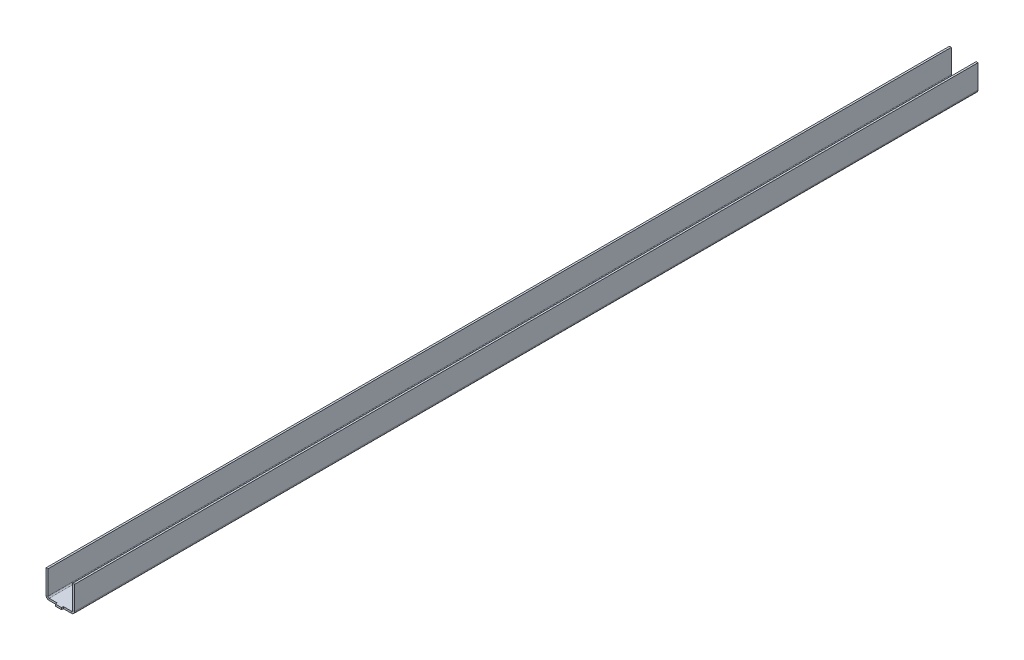
ISO-10303-21;
HEADER;
FILE_DESCRIPTION(('STEP AP214'),'2;1');
FILE_NAME('part.step','',(''),(''),'','','');
FILE_SCHEMA(('AUTOMOTIVE_DESIGN { 1 0 10303 214 1 1 1 1 }'));
ENDSEC;
DATA;
#1=APPLICATION_CONTEXT('core data for automotive mechanical design processes');
#2=APPLICATION_PROTOCOL_DEFINITION('international standard','automotive_design',2000,#1);
#3=PRODUCT_CONTEXT('',#1,'mechanical');
#4=PRODUCT('Part','Part','',(#3));
#5=PRODUCT_RELATED_PRODUCT_CATEGORY('part','',(#4));
#6=PRODUCT_DEFINITION_FORMATION('','',#4);
#7=PRODUCT_DEFINITION_CONTEXT('part definition',#1,'design');
#8=PRODUCT_DEFINITION('design','',#6,#7);
#9=PRODUCT_DEFINITION_SHAPE('','',#8);
#10=(LENGTH_UNIT() NAMED_UNIT(*) SI_UNIT(.MILLI.,.METRE.));
#11=(NAMED_UNIT(*) PLANE_ANGLE_UNIT() SI_UNIT($,.RADIAN.));
#12=(NAMED_UNIT(*) SI_UNIT($,.STERADIAN.) SOLID_ANGLE_UNIT());
#13=UNCERTAINTY_MEASURE_WITH_UNIT(LENGTH_MEASURE(1.E-05),#10,'distance_accuracy_value','');
#14=(GEOMETRIC_REPRESENTATION_CONTEXT(3) GLOBAL_UNCERTAINTY_ASSIGNED_CONTEXT((#13)) GLOBAL_UNIT_ASSIGNED_CONTEXT((#10,
#11,#12)) REPRESENTATION_CONTEXT('',''));
#15=CARTESIAN_POINT('',(0.,0.,0.));
#16=DIRECTION('',(0.,0.,1.));
#17=DIRECTION('',(1.,0.,0.));
#18=AXIS2_PLACEMENT_3D('',#15,#16,#17);
#19=CARTESIAN_POINT('',(1444.49647644812,-1.49999999999062,1829.98412298286));
#20=DIRECTION('',(0.,1.,0.));
#21=DIRECTION('',(-1.,0.,0.));
#22=AXIS2_PLACEMENT_3D('',#19,#20,#21);
#23=PLANE('',#22);
#24=DIRECTION('',(0.,0.,1.));
#25=VECTOR('',#24,1.);
#26=CARTESIAN_POINT('',(-11.5000000000001,-1.50000000000326,1829.98412298286));
#27=LINE('',#26,#25);
#28=CARTESIAN_POINT('',(-11.5000000000001,-1.50000000000325,1071.5));
#29=VERTEX_POINT('',#28);
#30=CARTESIAN_POINT('',(-11.5000000000001,-1.50000000000326,1798.5));
#31=VERTEX_POINT('',#30);
#32=EDGE_CURVE('E265',#29,#31,#27,.T.);
#33=ORIENTED_EDGE('',*,*,#32,.T.);
#34=DIRECTION('',(-1.,0.,0.));
#35=VECTOR('',#34,1.);
#36=CARTESIAN_POINT('',(1444.49647644812,-1.49999999999063,1798.5));
#37=LINE('',#36,#35);
#38=CARTESIAN_POINT('',(-10.0000000000001,-1.50000000000325,1798.5));
#39=VERTEX_POINT('',#38);
#40=EDGE_CURVE('E257',#39,#31,#37,.T.);
#41=ORIENTED_EDGE('',*,*,#40,.F.);
#42=DIRECTION('',(0.,0.,1.));
#43=VECTOR('',#42,1.);
#44=CARTESIAN_POINT('',(-10.0000000000001,-1.50000000000324,1829.98412298286));
#45=LINE('',#44,#43);
#46=CARTESIAN_POINT('',(-10.0000000000001,-1.50000000000324,1071.5));
#47=VERTEX_POINT('',#46);
#48=EDGE_CURVE('E523',#39,#47,#45,.F.);
#49=ORIENTED_EDGE('',*,*,#48,.T.);
#50=DIRECTION('',(-1.,0.,0.));
#51=VECTOR('',#50,1.);
#52=CARTESIAN_POINT('',(1444.49647644812,-1.49999999999062,1071.5));
#53=LINE('',#52,#51);
#54=EDGE_CURVE('E267',#47,#29,#53,.T.);
#55=ORIENTED_EDGE('',*,*,#54,.T.);
#56=EDGE_LOOP('',(#33,#41,#49,#55));
#57=FACE_BOUND('',#56,.T.);
#58=ADVANCED_FACE('F53',(#57),#23,.T.);
#59=CARTESIAN_POINT('',(1444.49647644812,-22.9999999999907,1071.5));
#60=DIRECTION('',(0.,0.,-1.));
#61=DIRECTION('',(0.,-1.,0.));
#62=AXIS2_PLACEMENT_3D('',#59,#60,#61);
#63=PLANE('',#62);
#64=DIRECTION('',(0.,1.,0.));
#65=VECTOR('',#64,1.);
#66=CARTESIAN_POINT('',(-11.5000000000001,-1.50000000000325,1071.5));
#67=LINE('',#66,#65);
#68=CARTESIAN_POINT('',(-11.5,-20.5000000000033,1071.5));
#69=VERTEX_POINT('',#68);
#70=EDGE_CURVE('E251',#69,#29,#67,.T.);
#71=ORIENTED_EDGE('',*,*,#70,.T.);
#72=ORIENTED_EDGE('',*,*,#54,.F.);
#73=DIRECTION('',(0.,1.,0.));
#74=VECTOR('',#73,1.);
#75=CARTESIAN_POINT('',(-10.0000000000001,-23.0000000000033,1071.5));
#76=LINE('',#75,#74);
#77=CARTESIAN_POINT('',(-9.99999999999983,-20.5000000000033,1071.5));
#78=VERTEX_POINT('',#77);
#79=EDGE_CURVE('E108',#47,#78,#76,.F.);
#80=ORIENTED_EDGE('',*,*,#79,.T.);
#81=DIRECTION('',(-1.,0.,0.));
#82=VECTOR('',#81,1.);
#83=CARTESIAN_POINT('',(1444.49647644812,-20.4999999999907,1071.5));
#84=LINE('',#83,#82);
#85=EDGE_CURVE('E248',#78,#69,#84,.T.);
#86=ORIENTED_EDGE('',*,*,#85,.T.);
#87=EDGE_LOOP('',(#71,#72,#80,#86));
#88=FACE_BOUND('',#87,.T.);
#89=ADVANCED_FACE('F250',(#88),#63,.T.);
#90=CARTESIAN_POINT('',(-11.5000000000001,-1.50000000000326,1829.98412298286));
#91=DIRECTION('',(1.,0.,0.));
#92=DIRECTION('',(0.,1.,0.));
#93=AXIS2_PLACEMENT_3D('',#90,#91,#92);
#94=PLANE('',#93);
#95=ORIENTED_EDGE('',*,*,#32,.F.);
#96=ORIENTED_EDGE('',*,*,#70,.F.);
#97=DIRECTION('',(0.,0.,-1.));
#98=VECTOR('',#97,1.);
#99=CARTESIAN_POINT('',(-11.4999999999999,-20.5000000000033,1829.98412298286));
#100=LINE('',#99,#98);
#101=CARTESIAN_POINT('',(-11.5,-20.5000000000033,1798.5));
#102=VERTEX_POINT('',#101);
#103=EDGE_CURVE('E263',#102,#69,#100,.T.);
#104=ORIENTED_EDGE('',*,*,#103,.F.);
#105=DIRECTION('',(0.,1.,0.));
#106=VECTOR('',#105,1.);
#107=CARTESIAN_POINT('',(-11.5000000000001,-1.50000000000326,1798.5));
#108=LINE('',#107,#106);
#109=EDGE_CURVE('E434',#31,#102,#108,.F.);
#110=ORIENTED_EDGE('',*,*,#109,.F.);
#111=EDGE_LOOP('',(#95,#96,#104,#110));
#112=FACE_BOUND('',#111,.T.);
#113=ADVANCED_FACE('F262',(#112),#94,.F.);
#114=CARTESIAN_POINT('',(1444.49647644812,-1.49999999999063,1798.5));
#115=DIRECTION('',(0.,0.,-1.));
#116=DIRECTION('',(0.,-1.,0.));
#117=AXIS2_PLACEMENT_3D('',#114,#115,#116);
#118=PLANE('',#117);
#119=ORIENTED_EDGE('',*,*,#40,.T.);
#120=ORIENTED_EDGE('',*,*,#109,.T.);
#121=DIRECTION('',(-1.,0.,0.));
#122=VECTOR('',#121,1.);
#123=CARTESIAN_POINT('',(1444.49647644812,-20.4999999999907,1798.5));
#124=LINE('',#123,#122);
#125=CARTESIAN_POINT('',(-10.,-20.5000000000033,1798.5));
#126=VERTEX_POINT('',#125);
#127=EDGE_CURVE('E58',#126,#102,#124,.T.);
#128=ORIENTED_EDGE('',*,*,#127,.F.);
#129=DIRECTION('',(0.,1.,0.));
#130=VECTOR('',#129,1.);
#131=CARTESIAN_POINT('',(-10.0000000000001,-1.50000000000326,1798.5));
#132=LINE('',#131,#130);
#133=EDGE_CURVE('E12',#39,#126,#132,.F.);
#134=ORIENTED_EDGE('',*,*,#133,.F.);
#135=EDGE_LOOP('',(#119,#120,#128,#134));
#136=FACE_BOUND('',#135,.T.);
#137=ADVANCED_FACE('F534',(#136),#118,.F.);
#138=CARTESIAN_POINT('',(-10.0000000000001,-1.50000000000324,1829.98412298286));
#139=DIRECTION('',(1.,0.,0.));
#140=DIRECTION('',(0.,1.,0.));
#141=AXIS2_PLACEMENT_3D('',#138,#139,#140);
#142=PLANE('',#141);
#143=DIRECTION('',(0.,0.,-1.));
#144=VECTOR('',#143,1.);
#145=CARTESIAN_POINT('',(-9.99999999999992,-20.5000000000033,1829.98412298286));
#146=LINE('',#145,#144);
#147=EDGE_CURVE('E65',#126,#78,#146,.T.);
#148=ORIENTED_EDGE('',*,*,#147,.T.);
#149=ORIENTED_EDGE('',*,*,#79,.F.);
#150=ORIENTED_EDGE('',*,*,#48,.F.);
#151=ORIENTED_EDGE('',*,*,#133,.T.);
#152=EDGE_LOOP('',(#148,#149,#150,#151));
#153=FACE_BOUND('',#152,.T.);
#154=ADVANCED_FACE('F56',(#153),#142,.T.);
#155=CARTESIAN_POINT('',(-10.,-23.0000000000033,1829.98412298286));
#156=DIRECTION('',(0.,1.,0.));
#157=DIRECTION('',(0.,0.,1.));
#158=AXIS2_PLACEMENT_3D('',#155,#156,#157);
#159=PLANE('',#158);
#160=DIRECTION('',(0.,0.,1.));
#161=VECTOR('',#160,1.);
#162=CARTESIAN_POINT('',(-9.00000000000001,-23.0000000000033,1829.98412298286));
#163=LINE('',#162,#161);
#164=CARTESIAN_POINT('',(-9.00000000000002,-23.0000000000033,1071.5));
#165=VERTEX_POINT('',#164);
#166=CARTESIAN_POINT('',(-9.00000000000001,-23.0000000000033,1798.5));
#167=VERTEX_POINT('',#166);
#168=EDGE_CURVE('E301',#165,#167,#163,.T.);
#169=ORIENTED_EDGE('',*,*,#168,.F.);
#170=DIRECTION('',(1.,0.,0.));
#171=VECTOR('',#170,1.);
#172=CARTESIAN_POINT('',(-10.,-23.0000000000033,1071.5));
#173=LINE('',#172,#171);
#174=CARTESIAN_POINT('',(-2.50000000000001,-23.0000000000033,1071.5));
#175=VERTEX_POINT('',#174);
#176=EDGE_CURVE('E306',#175,#165,#173,.F.);
#177=ORIENTED_EDGE('',*,*,#176,.F.);
#178=DIRECTION('',(0.,0.,-1.));
#179=VECTOR('',#178,1.);
#180=CARTESIAN_POINT('',(-2.50000000000001,-23.0000000000033,1071.5));
#181=LINE('',#180,#179);
#182=CARTESIAN_POINT('',(-2.50000000000001,-23.0000000000033,1066.5));
#183=VERTEX_POINT('',#182);
#184=EDGE_CURVE('E313',#175,#183,#181,.T.);
#185=ORIENTED_EDGE('',*,*,#184,.T.);
#186=DIRECTION('',(1.,0.,0.));
#187=VECTOR('',#186,1.);
#188=CARTESIAN_POINT('',(-2.50000000000001,-23.0000000000033,1066.5));
#189=LINE('',#188,#187);
#190=CARTESIAN_POINT('',(2.5,-23.0000000000033,1066.5));
#191=VERTEX_POINT('',#190);
#192=EDGE_CURVE('E318',#183,#191,#189,.T.);
#193=ORIENTED_EDGE('',*,*,#192,.T.);
#194=DIRECTION('',(0.,0.,1.));
#195=VECTOR('',#194,1.);
#196=CARTESIAN_POINT('',(2.5,-23.0000000000033,1071.5));
#197=LINE('',#196,#195);
#198=CARTESIAN_POINT('',(2.5,-23.0000000000033,1071.5));
#199=VERTEX_POINT('',#198);
#200=EDGE_CURVE('E330',#191,#199,#197,.T.);
#201=ORIENTED_EDGE('',*,*,#200,.T.);
#202=CARTESIAN_POINT('',(8.99999999999999,-23.0000000000033,1071.5));
#203=VERTEX_POINT('',#202);
#204=EDGE_CURVE('E314',#203,#199,#173,.F.);
#205=ORIENTED_EDGE('',*,*,#204,.F.);
#206=DIRECTION('',(0.,0.,-1.));
#207=VECTOR('',#206,1.);
#208=CARTESIAN_POINT('',(8.99999999999999,-23.0000000000033,1829.98412298286));
#209=LINE('',#208,#207);
#210=CARTESIAN_POINT('',(8.99999999999999,-23.0000000000033,1798.5));
#211=VERTEX_POINT('',#210);
#212=EDGE_CURVE('E333',#211,#203,#209,.T.);
#213=ORIENTED_EDGE('',*,*,#212,.F.);
#214=DIRECTION('',(1.,0.,0.));
#215=VECTOR('',#214,1.);
#216=CARTESIAN_POINT('',(-10.,-23.0000000000033,1798.5));
#217=LINE('',#216,#215);
#218=CARTESIAN_POINT('',(2.49999999999999,-23.0000000000033,1798.5));
#219=VERTEX_POINT('',#218);
#220=EDGE_CURVE('E337',#219,#211,#217,.T.);
#221=ORIENTED_EDGE('',*,*,#220,.F.);
#222=DIRECTION('',(0.,0.,1.));
#223=VECTOR('',#222,1.);
#224=CARTESIAN_POINT('',(2.49999999999999,-23.0000000000033,1798.5));
#225=LINE('',#224,#223);
#226=CARTESIAN_POINT('',(2.49999999999999,-23.0000000000033,1800.));
#227=VERTEX_POINT('',#226);
#228=EDGE_CURVE('E342',#219,#227,#225,.T.);
#229=ORIENTED_EDGE('',*,*,#228,.T.);
#230=DIRECTION('',(-1.,0.,0.));
#231=VECTOR('',#230,1.);
#232=CARTESIAN_POINT('',(2.49999999999999,-23.0000000000033,1800.));
#233=LINE('',#232,#231);
#234=CARTESIAN_POINT('',(-2.50000000000001,-23.0000000000033,1800.));
#235=VERTEX_POINT('',#234);
#236=EDGE_CURVE('E481',#227,#235,#233,.T.);
#237=ORIENTED_EDGE('',*,*,#236,.T.);
#238=DIRECTION('',(0.,0.,-1.));
#239=VECTOR('',#238,1.);
#240=CARTESIAN_POINT('',(-2.50000000000001,-23.0000000000033,1798.5));
#241=LINE('',#240,#239);
#242=CARTESIAN_POINT('',(-2.50000000000001,-23.0000000000033,1798.5));
#243=VERTEX_POINT('',#242);
#244=EDGE_CURVE('E478',#235,#243,#241,.T.);
#245=ORIENTED_EDGE('',*,*,#244,.T.);
#246=EDGE_CURVE('E343',#167,#243,#217,.T.);
#247=ORIENTED_EDGE('',*,*,#246,.F.);
#248=EDGE_LOOP('',(#169,#177,#185,#193,#201,#205,#213,#221,#229,#237,#245,#247));
#249=FACE_BOUND('',#248,.T.);
#250=ADVANCED_FACE('F489',(#249),#159,.F.);
#251=CARTESIAN_POINT('',(11.5,1445.94165131019,1071.5));
#252=DIRECTION('',(0.,0.,-1.));
#253=DIRECTION('',(0.,1.,0.));
#254=AXIS2_PLACEMENT_3D('',#251,#252,#253);
#255=PLANE('',#254);
#256=ORIENTED_EDGE('',*,*,#204,.T.);
#257=DIRECTION('',(0.,-1.,0.));
#258=VECTOR('',#257,1.);
#259=CARTESIAN_POINT('',(2.49999999999999,1445.94165131019,1071.5));
#260=LINE('',#259,#258);
#261=CARTESIAN_POINT('',(2.49999999999999,-21.500000000003,1071.5));
#262=VERTEX_POINT('',#261);
#263=EDGE_CURVE('E425',#262,#199,#260,.T.);
#264=ORIENTED_EDGE('',*,*,#263,.F.);
#265=DIRECTION('',(-1.,0.,0.));
#266=VECTOR('',#265,1.);
#267=CARTESIAN_POINT('',(11.5,-21.5000000000033,1071.5));
#268=LINE('',#267,#266);
#269=CARTESIAN_POINT('',(8.99999999999999,-21.5000000000029,1071.5));
#270=VERTEX_POINT('',#269);
#271=EDGE_CURVE('E119',#262,#270,#268,.F.);
#272=ORIENTED_EDGE('',*,*,#271,.T.);
#273=DIRECTION('',(0.,-1.,0.));
#274=VECTOR('',#273,1.);
#275=CARTESIAN_POINT('',(8.99999999999999,1445.94165131019,1071.5));
#276=LINE('',#275,#274);
#277=EDGE_CURVE('E428',#270,#203,#276,.T.);
#278=ORIENTED_EDGE('',*,*,#277,.T.);
#279=EDGE_LOOP('',(#256,#264,#272,#278));
#280=FACE_BOUND('',#279,.T.);
#281=ADVANCED_FACE('F666',(#280),#255,.T.);
#282=CARTESIAN_POINT('',(2.49999999999999,1445.94165131019,1071.5));
#283=DIRECTION('',(1.,0.,0.));
#284=DIRECTION('',(0.,1.,0.));
#285=AXIS2_PLACEMENT_3D('',#282,#283,#284);
#286=PLANE('',#285);
#287=ORIENTED_EDGE('',*,*,#200,.F.);
#288=DIRECTION('',(0.,-1.,0.));
#289=VECTOR('',#288,1.);
#290=CARTESIAN_POINT('',(2.49999999999999,1445.94165131019,1066.5));
#291=LINE('',#290,#289);
#292=CARTESIAN_POINT('',(2.49999999999999,-21.500000000003,1066.5));
#293=VERTEX_POINT('',#292);
#294=EDGE_CURVE('E421',#293,#191,#291,.T.);
#295=ORIENTED_EDGE('',*,*,#294,.F.);
#296=DIRECTION('',(0.,0.,1.));
#297=VECTOR('',#296,1.);
#298=CARTESIAN_POINT('',(2.49999999999999,-21.5000000000033,1071.5));
#299=LINE('',#298,#297);
#300=EDGE_CURVE('E131',#293,#262,#299,.T.);
#301=ORIENTED_EDGE('',*,*,#300,.T.);
#302=ORIENTED_EDGE('',*,*,#263,.T.);
#303=EDGE_LOOP('',(#287,#295,#301,#302));
#304=FACE_BOUND('',#303,.T.);
#305=ADVANCED_FACE('F653',(#304),#286,.T.);
#306=CARTESIAN_POINT('',(-2.5,1445.94165131019,1066.5));
#307=DIRECTION('',(0.,0.,-1.));
#308=DIRECTION('',(0.,1.,0.));
#309=AXIS2_PLACEMENT_3D('',#306,#307,#308);
#310=PLANE('',#309);
#311=ORIENTED_EDGE('',*,*,#192,.F.);
#312=DIRECTION('',(0.,-1.,0.));
#313=VECTOR('',#312,1.);
#314=CARTESIAN_POINT('',(-2.5,1445.94165131019,1066.5));
#315=LINE('',#314,#313);
#316=CARTESIAN_POINT('',(-2.5,-21.500000000003,1066.5));
#317=VERTEX_POINT('',#316);
#318=EDGE_CURVE('E417',#317,#183,#315,.T.);
#319=ORIENTED_EDGE('',*,*,#318,.F.);
#320=DIRECTION('',(1.,0.,0.));
#321=VECTOR('',#320,1.);
#322=CARTESIAN_POINT('',(-2.5,-21.5000000000033,1066.5));
#323=LINE('',#322,#321);
#324=EDGE_CURVE('E359',#317,#293,#323,.T.);
#325=ORIENTED_EDGE('',*,*,#324,.T.);
#326=ORIENTED_EDGE('',*,*,#294,.T.);
#327=EDGE_LOOP('',(#311,#319,#325,#326));
#328=FACE_BOUND('',#327,.T.);
#329=ADVANCED_FACE('F555',(#328),#310,.T.);
#330=CARTESIAN_POINT('',(-2.5,1445.94165131019,1071.5));
#331=DIRECTION('',(-1.,0.,0.));
#332=DIRECTION('',(0.,-1.,0.));
#333=AXIS2_PLACEMENT_3D('',#330,#331,#332);
#334=PLANE('',#333);
#335=ORIENTED_EDGE('',*,*,#184,.F.);
#336=DIRECTION('',(0.,-1.,0.));
#337=VECTOR('',#336,1.);
#338=CARTESIAN_POINT('',(-2.5,1445.94165131019,1071.5));
#339=LINE('',#338,#337);
#340=CARTESIAN_POINT('',(-2.5,-21.500000000003,1071.5));
#341=VERTEX_POINT('',#340);
#342=EDGE_CURVE('E413',#341,#175,#339,.T.);
#343=ORIENTED_EDGE('',*,*,#342,.F.);
#344=DIRECTION('',(0.,0.,-1.));
#345=VECTOR('',#344,1.);
#346=CARTESIAN_POINT('',(-2.5,-21.5000000000033,1071.5));
#347=LINE('',#346,#345);
#348=EDGE_CURVE('E364',#341,#317,#347,.T.);
#349=ORIENTED_EDGE('',*,*,#348,.T.);
#350=ORIENTED_EDGE('',*,*,#318,.T.);
#351=EDGE_LOOP('',(#335,#343,#349,#350));
#352=FACE_BOUND('',#351,.T.);
#353=ADVANCED_FACE('F550',(#352),#334,.T.);
#354=ORIENTED_EDGE('',*,*,#176,.T.);
#355=DIRECTION('',(0.,-1.,0.));
#356=VECTOR('',#355,1.);
#357=CARTESIAN_POINT('',(-9.00000000000001,1445.94165131019,1071.5));
#358=LINE('',#357,#356);
#359=CARTESIAN_POINT('',(-9.00000000000001,-21.5000000000033,1071.5));
#360=VERTEX_POINT('',#359);
#361=EDGE_CURVE('E280',#360,#165,#358,.T.);
#362=ORIENTED_EDGE('',*,*,#361,.F.);
#363=EDGE_CURVE('E368',#360,#341,#268,.F.);
#364=ORIENTED_EDGE('',*,*,#363,.T.);
#365=ORIENTED_EDGE('',*,*,#342,.T.);
#366=EDGE_LOOP('',(#354,#362,#364,#365));
#367=FACE_BOUND('',#366,.T.);
#368=ADVANCED_FACE('F547',(#367),#255,.T.);
#369=CARTESIAN_POINT('',(-9.99999999999999,1445.94165131019,1798.5));
#370=DIRECTION('',(0.,0.,-1.));
#371=DIRECTION('',(0.,1.,0.));
#372=AXIS2_PLACEMENT_3D('',#369,#370,#371);
#373=PLANE('',#372);
#374=DIRECTION('',(0.,-1.,0.));
#375=VECTOR('',#374,1.);
#376=CARTESIAN_POINT('',(-9.00000000000001,1445.94165131019,1798.5));
#377=LINE('',#376,#375);
#378=CARTESIAN_POINT('',(-9.,-21.5000000000033,1798.5));
#379=VERTEX_POINT('',#378);
#380=EDGE_CURVE('E407',#379,#167,#377,.T.);
#381=ORIENTED_EDGE('',*,*,#380,.T.);
#382=ORIENTED_EDGE('',*,*,#246,.T.);
#383=DIRECTION('',(0.,-1.,0.));
#384=VECTOR('',#383,1.);
#385=CARTESIAN_POINT('',(-2.5,1445.94165131019,1798.5));
#386=LINE('',#385,#384);
#387=CARTESIAN_POINT('',(-2.5,-21.500000000003,1798.5));
#388=VERTEX_POINT('',#387);
#389=EDGE_CURVE('E403',#388,#243,#386,.T.);
#390=ORIENTED_EDGE('',*,*,#389,.F.);
#391=DIRECTION('',(-1.,0.,0.));
#392=VECTOR('',#391,1.);
#393=CARTESIAN_POINT('',(-9.99999999999999,-21.5000000000033,1798.5));
#394=LINE('',#393,#392);
#395=EDGE_CURVE('E379',#379,#388,#394,.F.);
#396=ORIENTED_EDGE('',*,*,#395,.F.);
#397=EDGE_LOOP('',(#381,#382,#390,#396));
#398=FACE_BOUND('',#397,.T.);
#399=ADVANCED_FACE('F511',(#398),#373,.F.);
#400=CARTESIAN_POINT('',(-2.5,1445.94165131019,1798.5));
#401=DIRECTION('',(-1.,0.,0.));
#402=DIRECTION('',(0.,-1.,0.));
#403=AXIS2_PLACEMENT_3D('',#400,#401,#402);
#404=PLANE('',#403);
#405=ORIENTED_EDGE('',*,*,#244,.F.);
#406=DIRECTION('',(0.,-1.,0.));
#407=VECTOR('',#406,1.);
#408=CARTESIAN_POINT('',(-2.5,1445.94165131019,1800.));
#409=LINE('',#408,#407);
#410=CARTESIAN_POINT('',(-2.5,-21.500000000003,1800.));
#411=VERTEX_POINT('',#410);
#412=EDGE_CURVE('E399',#411,#235,#409,.T.);
#413=ORIENTED_EDGE('',*,*,#412,.F.);
#414=DIRECTION('',(0.,0.,-1.));
#415=VECTOR('',#414,1.);
#416=CARTESIAN_POINT('',(-2.5,-21.5000000000033,1798.5));
#417=LINE('',#416,#415);
#418=EDGE_CURVE('E375',#411,#388,#417,.T.);
#419=ORIENTED_EDGE('',*,*,#418,.T.);
#420=ORIENTED_EDGE('',*,*,#389,.T.);
#421=EDGE_LOOP('',(#405,#413,#419,#420));
#422=FACE_BOUND('',#421,.T.);
#423=ADVANCED_FACE('F506',(#422),#404,.T.);
#424=CARTESIAN_POINT('',(2.49999999999999,1445.94165131019,1800.));
#425=DIRECTION('',(0.,0.,1.));
#426=DIRECTION('',(0.,-1.,0.));
#427=AXIS2_PLACEMENT_3D('',#424,#425,#426);
#428=PLANE('',#427);
#429=ORIENTED_EDGE('',*,*,#236,.F.);
#430=DIRECTION('',(0.,-1.,0.));
#431=VECTOR('',#430,1.);
#432=CARTESIAN_POINT('',(2.49999999999999,1445.94165131019,1800.));
#433=LINE('',#432,#431);
#434=CARTESIAN_POINT('',(2.49999999999999,-21.500000000003,1800.));
#435=VERTEX_POINT('',#434);
#436=EDGE_CURVE('E395',#435,#227,#433,.T.);
#437=ORIENTED_EDGE('',*,*,#436,.F.);
#438=DIRECTION('',(-1.,0.,0.));
#439=VECTOR('',#438,1.);
#440=CARTESIAN_POINT('',(2.49999999999999,-21.5000000000033,1800.));
#441=LINE('',#440,#439);
#442=EDGE_CURVE('E378',#435,#411,#441,.T.);
#443=ORIENTED_EDGE('',*,*,#442,.T.);
#444=ORIENTED_EDGE('',*,*,#412,.T.);
#445=EDGE_LOOP('',(#429,#437,#443,#444));
#446=FACE_BOUND('',#445,.T.);
#447=ADVANCED_FACE('F494',(#446),#428,.T.);
#448=CARTESIAN_POINT('',(2.49999999999999,1445.94165131019,1798.5));
#449=DIRECTION('',(1.,0.,0.));
#450=DIRECTION('',(0.,1.,0.));
#451=AXIS2_PLACEMENT_3D('',#448,#449,#450);
#452=PLANE('',#451);
#453=ORIENTED_EDGE('',*,*,#228,.F.);
#454=DIRECTION('',(0.,-1.,0.));
#455=VECTOR('',#454,1.);
#456=CARTESIAN_POINT('',(2.49999999999999,1445.94165131019,1798.5));
#457=LINE('',#456,#455);
#458=CARTESIAN_POINT('',(2.49999999999999,-21.5000000000028,1798.5));
#459=VERTEX_POINT('',#458);
#460=EDGE_CURVE('E391',#459,#219,#457,.T.);
#461=ORIENTED_EDGE('',*,*,#460,.F.);
#462=DIRECTION('',(0.,0.,1.));
#463=VECTOR('',#462,1.);
#464=CARTESIAN_POINT('',(2.49999999999999,-21.5000000000033,1798.5));
#465=LINE('',#464,#463);
#466=EDGE_CURVE('E382',#459,#435,#465,.T.);
#467=ORIENTED_EDGE('',*,*,#466,.T.);
#468=ORIENTED_EDGE('',*,*,#436,.T.);
#469=EDGE_LOOP('',(#453,#461,#467,#468));
#470=FACE_BOUND('',#469,.T.);
#471=ADVANCED_FACE('F497',(#470),#452,.T.);
#472=ORIENTED_EDGE('',*,*,#460,.T.);
#473=ORIENTED_EDGE('',*,*,#220,.T.);
#474=DIRECTION('',(0.,-1.,0.));
#475=VECTOR('',#474,1.);
#476=CARTESIAN_POINT('',(8.99999999999999,1445.94165131019,1798.5));
#477=LINE('',#476,#475);
#478=CARTESIAN_POINT('',(8.99999999999999,-21.5000000000033,1798.5));
#479=VERTEX_POINT('',#478);
#480=EDGE_CURVE('E387',#479,#211,#477,.T.);
#481=ORIENTED_EDGE('',*,*,#480,.F.);
#482=EDGE_CURVE('E386',#459,#479,#394,.F.);
#483=ORIENTED_EDGE('',*,*,#482,.F.);
#484=EDGE_LOOP('',(#472,#473,#481,#483));
#485=FACE_BOUND('',#484,.T.);
#486=ADVANCED_FACE('F635',(#485),#373,.F.);
#487=CARTESIAN_POINT('',(-9.99999999999999,-21.5000000000033,1829.98412298286));
#488=DIRECTION('',(0.,1.,0.));
#489=DIRECTION('',(0.,0.,1.));
#490=AXIS2_PLACEMENT_3D('',#487,#488,#489);
#491=PLANE('',#490);
#492=DIRECTION('',(0.,0.,-1.));
#493=VECTOR('',#492,1.);
#494=CARTESIAN_POINT('',(8.99999999999999,-21.5000000000033,1829.98412298286));
#495=LINE('',#494,#493);
#496=EDGE_CURVE('E475',#479,#270,#495,.T.);
#497=ORIENTED_EDGE('',*,*,#496,.T.);
#498=ORIENTED_EDGE('',*,*,#271,.F.);
#499=ORIENTED_EDGE('',*,*,#300,.F.);
#500=ORIENTED_EDGE('',*,*,#324,.F.);
#501=ORIENTED_EDGE('',*,*,#348,.F.);
#502=ORIENTED_EDGE('',*,*,#363,.F.);
#503=DIRECTION('',(0.,0.,1.));
#504=VECTOR('',#503,1.);
#505=CARTESIAN_POINT('',(-9.00000000000001,-21.5000000000033,1829.98412298286));
#506=LINE('',#505,#504);
#507=EDGE_CURVE('E369',#360,#379,#506,.T.);
#508=ORIENTED_EDGE('',*,*,#507,.T.);
#509=ORIENTED_EDGE('',*,*,#395,.T.);
#510=ORIENTED_EDGE('',*,*,#418,.F.);
#511=ORIENTED_EDGE('',*,*,#442,.F.);
#512=ORIENTED_EDGE('',*,*,#466,.F.);
#513=ORIENTED_EDGE('',*,*,#482,.T.);
#514=EDGE_LOOP('',(#497,#498,#499,#500,#501,#502,#508,#509,#510,#511,#512,#513));
#515=FACE_BOUND('',#514,.T.);
#516=ADVANCED_FACE('F501',(#515),#491,.T.);
#517=CARTESIAN_POINT('',(-1444.49647644812,-1.50000000001144,1829.98412298286));
#518=DIRECTION('',(0.,1.,0.));
#519=DIRECTION('',(-1.,0.,0.));
#520=AXIS2_PLACEMENT_3D('',#517,#518,#519);
#521=PLANE('',#520);
#522=DIRECTION('',(0.,0.,1.));
#523=VECTOR('',#522,1.);
#524=CARTESIAN_POINT('',(11.4999999999998,-1.49999999999982,1829.98412298286));
#525=LINE('',#524,#523);
#526=CARTESIAN_POINT('',(11.4999999999996,-1.49999999999982,1798.5));
#527=VERTEX_POINT('',#526);
#528=CARTESIAN_POINT('',(11.4999999999998,-1.49999999999983,1071.5));
#529=VERTEX_POINT('',#528);
#530=EDGE_CURVE('E571',#527,#529,#525,.F.);
#531=ORIENTED_EDGE('',*,*,#530,.T.);
#532=DIRECTION('',(1.,0.,0.));
#533=VECTOR('',#532,1.);
#534=CARTESIAN_POINT('',(-1444.49647644812,-1.50000000001144,1071.5));
#535=LINE('',#534,#533);
#536=CARTESIAN_POINT('',(9.99999999999956,-1.49999999999984,1071.5));
#537=VERTEX_POINT('',#536);
#538=EDGE_CURVE('E307',#537,#529,#535,.T.);
#539=ORIENTED_EDGE('',*,*,#538,.F.);
#540=DIRECTION('',(0.,0.,1.));
#541=VECTOR('',#540,1.);
#542=CARTESIAN_POINT('',(9.99999999999984,-1.49999999999983,1829.98412298286));
#543=LINE('',#542,#541);
#544=CARTESIAN_POINT('',(9.99999999999988,-1.49999999999983,1798.5));
#545=VERTEX_POINT('',#544);
#546=EDGE_CURVE('E568',#537,#545,#543,.T.);
#547=ORIENTED_EDGE('',*,*,#546,.T.);
#548=DIRECTION('',(1.,0.,0.));
#549=VECTOR('',#548,1.);
#550=CARTESIAN_POINT('',(-1444.49647644812,-1.50000000001144,1798.5));
#551=LINE('',#550,#549);
#552=EDGE_CURVE('E471',#545,#527,#551,.T.);
#553=ORIENTED_EDGE('',*,*,#552,.T.);
#554=EDGE_LOOP('',(#531,#539,#547,#553));
#555=FACE_BOUND('',#554,.T.);
#556=ADVANCED_FACE('F619',(#555),#521,.T.);
#557=CARTESIAN_POINT('',(10.,-21.5000000000033,1829.98412298286));
#558=DIRECTION('',(-1.,0.,0.));
#559=DIRECTION('',(0.,-1.,0.));
#560=AXIS2_PLACEMENT_3D('',#557,#558,#559);
#561=PLANE('',#560);
#562=ORIENTED_EDGE('',*,*,#546,.F.);
#563=DIRECTION('',(0.,1.,0.));
#564=VECTOR('',#563,1.);
#565=CARTESIAN_POINT('',(9.99999999999999,-20.5000000000033,1071.5));
#566=LINE('',#565,#564);
#567=CARTESIAN_POINT('',(9.99999999999999,-20.5000000000033,1071.5));
#568=VERTEX_POINT('',#567);
#569=EDGE_CURVE('E451',#568,#537,#566,.T.);
#570=ORIENTED_EDGE('',*,*,#569,.F.);
#571=DIRECTION('',(0.,0.,1.));
#572=VECTOR('',#571,1.);
#573=CARTESIAN_POINT('',(9.99999999999999,-20.5000000000033,1829.98412298286));
#574=LINE('',#573,#572);
#575=CARTESIAN_POINT('',(9.99999999999999,-20.5000000000033,1798.5));
#576=VERTEX_POINT('',#575);
#577=EDGE_CURVE('E466',#568,#576,#574,.T.);
#578=ORIENTED_EDGE('',*,*,#577,.T.);
#579=DIRECTION('',(0.,1.,0.));
#580=VECTOR('',#579,1.);
#581=CARTESIAN_POINT('',(9.99999999999999,-21.5000000000033,1798.5));
#582=LINE('',#581,#580);
#583=EDGE_CURVE('E461',#576,#545,#582,.T.);
#584=ORIENTED_EDGE('',*,*,#583,.T.);
#585=EDGE_LOOP('',(#562,#570,#578,#584));
#586=FACE_BOUND('',#585,.T.);
#587=ADVANCED_FACE('F617',(#586),#561,.T.);
#588=CARTESIAN_POINT('',(-1444.49647644812,-21.5000000000149,1798.5));
#589=DIRECTION('',(0.,0.,-1.));
#590=DIRECTION('',(-1.,0.,0.));
#591=AXIS2_PLACEMENT_3D('',#588,#589,#590);
#592=PLANE('',#591);
#593=DIRECTION('',(1.,0.,0.));
#594=VECTOR('',#593,1.);
#595=CARTESIAN_POINT('',(-1444.49647644812,-20.5000000000149,1798.5));
#596=LINE('',#595,#594);
#597=CARTESIAN_POINT('',(11.5,-20.5000000000033,1798.5));
#598=VERTEX_POINT('',#597);
#599=EDGE_CURVE('E458',#576,#598,#596,.T.);
#600=ORIENTED_EDGE('',*,*,#599,.T.);
#601=DIRECTION('',(0.,-1.,0.));
#602=VECTOR('',#601,1.);
#603=CARTESIAN_POINT('',(11.5,-21.5000000000033,1798.5));
#604=LINE('',#603,#602);
#605=EDGE_CURVE('E452',#598,#527,#604,.F.);
#606=ORIENTED_EDGE('',*,*,#605,.T.);
#607=ORIENTED_EDGE('',*,*,#552,.F.);
#608=ORIENTED_EDGE('',*,*,#583,.F.);
#609=EDGE_LOOP('',(#600,#606,#607,#608));
#610=FACE_BOUND('',#609,.T.);
#611=ADVANCED_FACE('F626',(#610),#592,.F.);
#612=CARTESIAN_POINT('',(11.5,-21.5000000000033,1829.98412298286));
#613=DIRECTION('',(-1.,0.,0.));
#614=DIRECTION('',(0.,-1.,0.));
#615=AXIS2_PLACEMENT_3D('',#612,#613,#614);
#616=PLANE('',#615);
#617=DIRECTION('',(0.,0.,1.));
#618=VECTOR('',#617,1.);
#619=CARTESIAN_POINT('',(11.5,-20.5000000000033,1829.98412298286));
#620=LINE('',#619,#618);
#621=CARTESIAN_POINT('',(11.5,-20.5000000000033,1071.5));
#622=VERTEX_POINT('',#621);
#623=EDGE_CURVE('E574',#622,#598,#620,.T.);
#624=ORIENTED_EDGE('',*,*,#623,.F.);
#625=DIRECTION('',(0.,-1.,0.));
#626=VECTOR('',#625,1.);
#627=CARTESIAN_POINT('',(11.5,-21.5000000000033,1071.5));
#628=LINE('',#627,#626);
#629=EDGE_CURVE('E445',#529,#622,#628,.T.);
#630=ORIENTED_EDGE('',*,*,#629,.F.);
#631=ORIENTED_EDGE('',*,*,#530,.F.);
#632=ORIENTED_EDGE('',*,*,#605,.F.);
#633=EDGE_LOOP('',(#624,#630,#631,#632));
#634=FACE_BOUND('',#633,.T.);
#635=ADVANCED_FACE('F624',(#634),#616,.F.);
#636=CARTESIAN_POINT('',(-1444.49647644812,-20.5000000000149,1071.5));
#637=DIRECTION('',(0.,0.,-1.));
#638=DIRECTION('',(-1.,0.,0.));
#639=AXIS2_PLACEMENT_3D('',#636,#637,#638);
#640=PLANE('',#639);
#641=ORIENTED_EDGE('',*,*,#629,.T.);
#642=DIRECTION('',(1.,0.,0.));
#643=VECTOR('',#642,1.);
#644=CARTESIAN_POINT('',(-1444.49647644812,-20.5000000000149,1071.5));
#645=LINE('',#644,#643);
#646=EDGE_CURVE('E308',#568,#622,#645,.T.);
#647=ORIENTED_EDGE('',*,*,#646,.F.);
#648=ORIENTED_EDGE('',*,*,#569,.T.);
#649=ORIENTED_EDGE('',*,*,#538,.T.);
#650=EDGE_LOOP('',(#641,#647,#648,#649));
#651=FACE_BOUND('',#650,.T.);
#652=ADVANCED_FACE('F614',(#651),#640,.T.);
#653=CARTESIAN_POINT('',(8.99999999999999,-20.5000000000033,1798.5));
#654=DIRECTION('',(0.,0.,1.));
#655=DIRECTION('',(1.,0.,0.));
#656=AXIS2_PLACEMENT_3D('',#653,#654,#655);
#657=PLANE('',#656);
#658=ORIENTED_EDGE('',*,*,#599,.F.);
#659=CARTESIAN_POINT('',(8.99999999999999,-20.5000000000033,1798.5));
#660=DIRECTION('',(0.,0.,1.));
#661=DIRECTION('',(1.,0.,0.));
#662=AXIS2_PLACEMENT_3D('',#659,#660,#661);
#663=CIRCLE('',#662,0.999999999999999);
#664=EDGE_CURVE('E585',#576,#479,#663,.F.);
#665=ORIENTED_EDGE('',*,*,#664,.T.);
#666=ORIENTED_EDGE('',*,*,#480,.T.);
#667=CARTESIAN_POINT('',(8.99999999999999,-20.5000000000033,1798.5));
#668=DIRECTION('',(0.,0.,1.));
#669=DIRECTION('',(1.,0.,0.));
#670=AXIS2_PLACEMENT_3D('',#667,#668,#669);
#671=CIRCLE('',#670,2.5);
#672=EDGE_CURVE('E578',#598,#211,#671,.F.);
#673=ORIENTED_EDGE('',*,*,#672,.F.);
#674=EDGE_LOOP('',(#658,#665,#666,#673));
#675=FACE_BOUND('',#674,.T.);
#676=ADVANCED_FACE('F629',(#675),#657,.T.);
#677=CARTESIAN_POINT('',(8.99999999999999,-20.5000000000033,1071.5));
#678=DIRECTION('',(0.,0.,-1.));
#679=DIRECTION('',(-1.,0.,0.));
#680=AXIS2_PLACEMENT_3D('',#677,#678,#679);
#681=PLANE('',#680);
#682=ORIENTED_EDGE('',*,*,#277,.F.);
#683=CARTESIAN_POINT('',(8.99999999999999,-20.5000000000033,1071.5));
#684=DIRECTION('',(0.,0.,1.));
#685=DIRECTION('',(1.,0.,0.));
#686=AXIS2_PLACEMENT_3D('',#683,#684,#685);
#687=CIRCLE('',#686,0.999999999999999);
#688=EDGE_CURVE('E286',#270,#568,#687,.T.);
#689=ORIENTED_EDGE('',*,*,#688,.T.);
#690=ORIENTED_EDGE('',*,*,#646,.T.);
#691=CARTESIAN_POINT('',(8.99999999999999,-20.5000000000033,1071.5));
#692=DIRECTION('',(0.,0.,1.));
#693=DIRECTION('',(1.,0.,0.));
#694=AXIS2_PLACEMENT_3D('',#691,#692,#693);
#695=CIRCLE('',#694,2.5);
#696=EDGE_CURVE('E581',#203,#622,#695,.T.);
#697=ORIENTED_EDGE('',*,*,#696,.F.);
#698=EDGE_LOOP('',(#682,#689,#690,#697));
#699=FACE_BOUND('',#698,.T.);
#700=ADVANCED_FACE('F604',(#699),#681,.T.);
#701=CARTESIAN_POINT('',(8.99999999999999,-20.5000000000033,335.499415761102));
#702=DIRECTION('',(0.,0.,1.));
#703=DIRECTION('',(1.,0.,0.));
#704=AXIS2_PLACEMENT_3D('',#701,#702,#703);
#705=CYLINDRICAL_SURFACE('',#704,2.5);
#706=ORIENTED_EDGE('',*,*,#696,.T.);
#707=ORIENTED_EDGE('',*,*,#623,.T.);
#708=ORIENTED_EDGE('',*,*,#672,.T.);
#709=ORIENTED_EDGE('',*,*,#212,.T.);
#710=EDGE_LOOP('',(#706,#707,#708,#709));
#711=FACE_BOUND('',#710,.T.);
#712=ADVANCED_FACE('F631',(#711),#705,.T.);
#713=CARTESIAN_POINT('',(8.99999999999999,-20.5000000000033,335.499415761102));
#714=DIRECTION('',(0.,0.,1.));
#715=DIRECTION('',(1.,0.,0.));
#716=AXIS2_PLACEMENT_3D('',#713,#714,#715);
#717=CYLINDRICAL_SURFACE('',#716,0.999999999999999);
#718=ORIENTED_EDGE('',*,*,#688,.F.);
#719=ORIENTED_EDGE('',*,*,#496,.F.);
#720=ORIENTED_EDGE('',*,*,#664,.F.);
#721=ORIENTED_EDGE('',*,*,#577,.F.);
#722=EDGE_LOOP('',(#718,#719,#720,#721));
#723=FACE_BOUND('',#722,.T.);
#724=ADVANCED_FACE('F609',(#723),#717,.F.);
#725=CARTESIAN_POINT('',(-9.,-20.5000000000033,1798.5));
#726=DIRECTION('',(0.,0.,1.));
#727=DIRECTION('',(1.,0.,0.));
#728=AXIS2_PLACEMENT_3D('',#725,#726,#727);
#729=PLANE('',#728);
#730=ORIENTED_EDGE('',*,*,#380,.F.);
#731=CARTESIAN_POINT('',(-9.,-20.5000000000033,1798.5));
#732=DIRECTION('',(0.,0.,1.));
#733=DIRECTION('',(1.,0.,0.));
#734=AXIS2_PLACEMENT_3D('',#731,#732,#733);
#735=CIRCLE('',#734,0.999999999999999);
#736=EDGE_CURVE('E282',#379,#126,#735,.F.);
#737=ORIENTED_EDGE('',*,*,#736,.T.);
#738=ORIENTED_EDGE('',*,*,#127,.T.);
#739=CARTESIAN_POINT('',(-9.,-20.5000000000033,1798.5));
#740=DIRECTION('',(0.,0.,1.));
#741=DIRECTION('',(1.,0.,0.));
#742=AXIS2_PLACEMENT_3D('',#739,#740,#741);
#743=CIRCLE('',#742,2.5);
#744=EDGE_CURVE('E276',#167,#102,#743,.F.);
#745=ORIENTED_EDGE('',*,*,#744,.F.);
#746=EDGE_LOOP('',(#730,#737,#738,#745));
#747=FACE_BOUND('',#746,.T.);
#748=ADVANCED_FACE('F536',(#747),#729,.T.);
#749=CARTESIAN_POINT('',(-9.,-20.5000000000033,1071.5));
#750=DIRECTION('',(0.,0.,-1.));
#751=DIRECTION('',(-1.,0.,0.));
#752=AXIS2_PLACEMENT_3D('',#749,#750,#751);
#753=PLANE('',#752);
#754=ORIENTED_EDGE('',*,*,#85,.F.);
#755=CARTESIAN_POINT('',(-9.,-20.5000000000033,1071.5));
#756=DIRECTION('',(0.,0.,1.));
#757=DIRECTION('',(1.,0.,0.));
#758=AXIS2_PLACEMENT_3D('',#755,#756,#757);
#759=CIRCLE('',#758,0.999999999999999);
#760=EDGE_CURVE('E289',#78,#360,#759,.T.);
#761=ORIENTED_EDGE('',*,*,#760,.T.);
#762=ORIENTED_EDGE('',*,*,#361,.T.);
#763=CARTESIAN_POINT('',(-9.,-20.5000000000033,1071.5));
#764=DIRECTION('',(0.,0.,1.));
#765=DIRECTION('',(1.,0.,0.));
#766=AXIS2_PLACEMENT_3D('',#763,#764,#765);
#767=CIRCLE('',#766,2.5);
#768=EDGE_CURVE('E273',#69,#165,#767,.T.);
#769=ORIENTED_EDGE('',*,*,#768,.F.);
#770=EDGE_LOOP('',(#754,#761,#762,#769));
#771=FACE_BOUND('',#770,.T.);
#772=ADVANCED_FACE('F278',(#771),#753,.T.);
#773=CARTESIAN_POINT('',(-9.,-20.5000000000033,336.495414980288));
#774=DIRECTION('',(0.,0.,1.));
#775=DIRECTION('',(1.,0.,0.));
#776=AXIS2_PLACEMENT_3D('',#773,#774,#775);
#777=CYLINDRICAL_SURFACE('',#776,2.5);
#778=ORIENTED_EDGE('',*,*,#768,.T.);
#779=ORIENTED_EDGE('',*,*,#168,.T.);
#780=ORIENTED_EDGE('',*,*,#744,.T.);
#781=ORIENTED_EDGE('',*,*,#103,.T.);
#782=EDGE_LOOP('',(#778,#779,#780,#781));
#783=FACE_BOUND('',#782,.T.);
#784=ADVANCED_FACE('F272',(#783),#777,.T.);
#785=CARTESIAN_POINT('',(-9.,-20.5000000000033,336.495414980288));
#786=DIRECTION('',(0.,0.,1.));
#787=DIRECTION('',(1.,0.,0.));
#788=AXIS2_PLACEMENT_3D('',#785,#786,#787);
#789=CYLINDRICAL_SURFACE('',#788,0.999999999999999);
#790=ORIENTED_EDGE('',*,*,#760,.F.);
#791=ORIENTED_EDGE('',*,*,#147,.F.);
#792=ORIENTED_EDGE('',*,*,#736,.F.);
#793=ORIENTED_EDGE('',*,*,#507,.F.);
#794=EDGE_LOOP('',(#790,#791,#792,#793));
#795=FACE_BOUND('',#794,.T.);
#796=ADVANCED_FACE('F541',(#795),#789,.F.);
#797=CLOSED_SHELL('',(#58,#89,#113,#137,#154,#250,#281,#305,#329,#353,#368,#399,#423,#447,#471,
#486,#516,#556,#587,#611,#635,#652,#676,#700,#712,#724,#748,#772,#784,#796));
#798=MANIFOLD_SOLID_BREP('B2',#797);
#799=ADVANCED_BREP_SHAPE_REPRESENTATION('',(#18,#798),#14);
#800=SHAPE_DEFINITION_REPRESENTATION(#9,#799);
ENDSEC;
END-ISO-10303-21;
